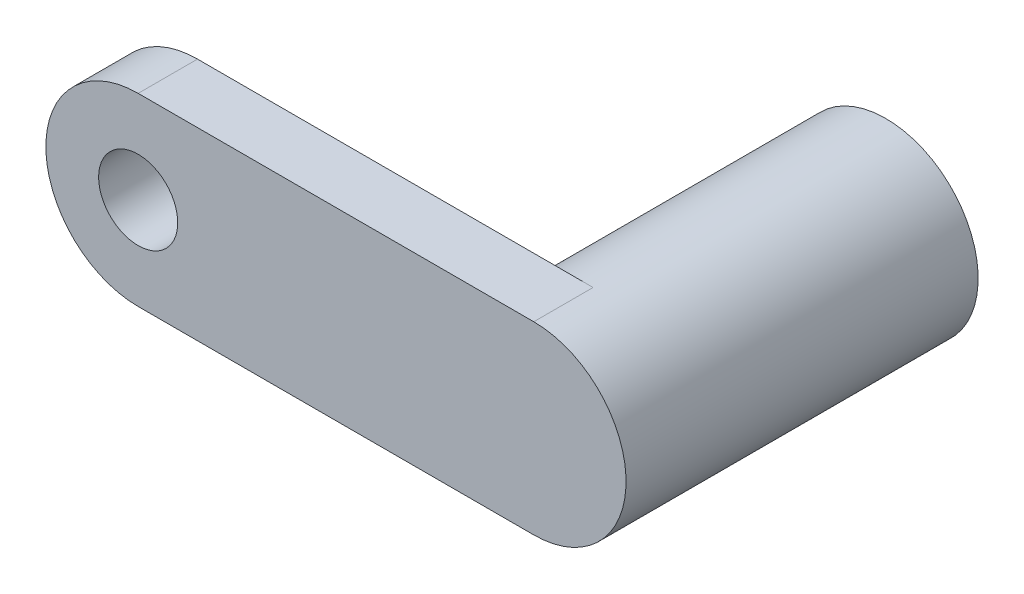
ISO-10303-21;
HEADER;
FILE_DESCRIPTION(('STEP AP214'),'2;1');
FILE_NAME('part.step','',(''),(''),'','','');
FILE_SCHEMA(('AUTOMOTIVE_DESIGN { 1 0 10303 214 1 1 1 1 }'));
ENDSEC;
DATA;
#1=APPLICATION_CONTEXT('core data for automotive mechanical design processes');
#2=APPLICATION_PROTOCOL_DEFINITION('international standard','automotive_design',2000,#1);
#3=PRODUCT_CONTEXT('',#1,'mechanical');
#4=PRODUCT('Part','Part','',(#3));
#5=PRODUCT_RELATED_PRODUCT_CATEGORY('part','',(#4));
#6=PRODUCT_DEFINITION_FORMATION('','',#4);
#7=PRODUCT_DEFINITION_CONTEXT('part definition',#1,'design');
#8=PRODUCT_DEFINITION('design','',#6,#7);
#9=PRODUCT_DEFINITION_SHAPE('','',#8);
#10=(LENGTH_UNIT() NAMED_UNIT(*) SI_UNIT(.MILLI.,.METRE.));
#11=(NAMED_UNIT(*) PLANE_ANGLE_UNIT() SI_UNIT($,.RADIAN.));
#12=(NAMED_UNIT(*) SI_UNIT($,.STERADIAN.) SOLID_ANGLE_UNIT());
#13=UNCERTAINTY_MEASURE_WITH_UNIT(LENGTH_MEASURE(1.E-05),#10,'distance_accuracy_value','');
#14=(GEOMETRIC_REPRESENTATION_CONTEXT(3) GLOBAL_UNCERTAINTY_ASSIGNED_CONTEXT((#13)) GLOBAL_UNIT_ASSIGNED_CONTEXT((#10,
#11,#12)) REPRESENTATION_CONTEXT('',''));
#15=CARTESIAN_POINT('',(0.,0.,0.));
#16=DIRECTION('',(0.,0.,1.));
#17=DIRECTION('',(1.,0.,0.));
#18=AXIS2_PLACEMENT_3D('',#15,#16,#17);
#19=CARTESIAN_POINT('',(0.,0.,4.5));
#20=DIRECTION('',(0.,0.,-1.));
#21=DIRECTION('',(-1.,0.,0.));
#22=AXIS2_PLACEMENT_3D('',#19,#20,#21);
#23=CYLINDRICAL_SURFACE('',#22,7.);
#24=CARTESIAN_POINT('',(0.,0.,0.));
#25=DIRECTION('',(0.,0.,-1.));
#26=DIRECTION('',(-1.,0.,0.));
#27=AXIS2_PLACEMENT_3D('',#24,#25,#26);
#28=CIRCLE('',#27,7.);
#29=CARTESIAN_POINT('',(0.,-7.,0.));
#30=VERTEX_POINT('',#29);
#31=CARTESIAN_POINT('',(0.,7.,0.));
#32=VERTEX_POINT('',#31);
#33=EDGE_CURVE('E82',#30,#32,#28,.T.);
#34=ORIENTED_EDGE('',*,*,#33,.F.);
#35=DIRECTION('',(0.,0.,-1.));
#36=VECTOR('',#35,1.);
#37=CARTESIAN_POINT('',(0.,-7.,4.5));
#38=LINE('',#37,#36);
#39=CARTESIAN_POINT('',(0.,-7.,4.5));
#40=VERTEX_POINT('',#39);
#41=EDGE_CURVE('E42',#40,#30,#38,.T.);
#42=ORIENTED_EDGE('',*,*,#41,.F.);
#43=CARTESIAN_POINT('',(0.,0.,4.5));
#44=DIRECTION('',(0.,0.,-1.));
#45=DIRECTION('',(-1.,0.,0.));
#46=AXIS2_PLACEMENT_3D('',#43,#44,#45);
#47=CIRCLE('',#46,7.);
#48=CARTESIAN_POINT('',(0.,7.,4.5));
#49=VERTEX_POINT('',#48);
#50=EDGE_CURVE('E98',#40,#49,#47,.T.);
#51=ORIENTED_EDGE('',*,*,#50,.T.);
#52=DIRECTION('',(0.,0.,-1.));
#53=VECTOR('',#52,1.);
#54=CARTESIAN_POINT('',(0.,7.,4.5));
#55=LINE('',#54,#53);
#56=EDGE_CURVE('E36',#49,#32,#55,.T.);
#57=ORIENTED_EDGE('',*,*,#56,.T.);
#58=EDGE_LOOP('',(#34,#42,#51,#57));
#59=FACE_BOUND('',#58,.T.);
#60=ADVANCED_FACE('F33',(#59),#23,.T.);
#61=CARTESIAN_POINT('',(30.,-7.,4.5));
#62=DIRECTION('',(0.,-1.,0.));
#63=DIRECTION('',(0.,0.,-1.));
#64=AXIS2_PLACEMENT_3D('',#61,#62,#63);
#65=PLANE('',#64);
#66=DIRECTION('',(-1.,0.,0.));
#67=VECTOR('',#66,1.);
#68=CARTESIAN_POINT('',(30.,-7.,0.));
#69=LINE('',#68,#67);
#70=CARTESIAN_POINT('',(30.,-7.,0.));
#71=VERTEX_POINT('',#70);
#72=EDGE_CURVE('E83',#71,#30,#69,.T.);
#73=ORIENTED_EDGE('',*,*,#72,.F.);
#74=DIRECTION('',(0.,0.,-1.));
#75=VECTOR('',#74,1.);
#76=CARTESIAN_POINT('',(30.,-7.,4.5));
#77=LINE('',#76,#75);
#78=CARTESIAN_POINT('',(30.,-7.,4.5));
#79=VERTEX_POINT('',#78);
#80=EDGE_CURVE('E91',#79,#71,#77,.T.);
#81=ORIENTED_EDGE('',*,*,#80,.F.);
#82=DIRECTION('',(-1.,0.,0.));
#83=VECTOR('',#82,1.);
#84=CARTESIAN_POINT('',(30.,-7.,4.5));
#85=LINE('',#84,#83);
#86=EDGE_CURVE('E105',#79,#40,#85,.T.);
#87=ORIENTED_EDGE('',*,*,#86,.T.);
#88=ORIENTED_EDGE('',*,*,#41,.T.);
#89=EDGE_LOOP('',(#73,#81,#87,#88));
#90=FACE_BOUND('',#89,.T.);
#91=ADVANCED_FACE('F97',(#90),#65,.T.);
#92=CARTESIAN_POINT('',(30.,0.,4.5));
#93=DIRECTION('',(0.,0.,-1.));
#94=DIRECTION('',(-1.,0.,0.));
#95=AXIS2_PLACEMENT_3D('',#92,#93,#94);
#96=CYLINDRICAL_SURFACE('',#95,7.);
#97=ORIENTED_EDGE('',*,*,#80,.T.);
#98=CARTESIAN_POINT('',(30.,0.,0.));
#99=DIRECTION('',(0.,0.,-1.));
#100=DIRECTION('',(-1.,0.,0.));
#101=AXIS2_PLACEMENT_3D('',#98,#99,#100);
#102=CIRCLE('',#101,7.);
#103=CARTESIAN_POINT('',(30.,7.,0.));
#104=VERTEX_POINT('',#103);
#105=EDGE_CURVE('E11',#71,#104,#102,.T.);
#106=ORIENTED_EDGE('',*,*,#105,.T.);
#107=DIRECTION('',(0.,0.,-1.));
#108=VECTOR('',#107,1.);
#109=CARTESIAN_POINT('',(30.,7.,4.5));
#110=LINE('',#109,#108);
#111=CARTESIAN_POINT('',(30.,7.,4.5));
#112=VERTEX_POINT('',#111);
#113=EDGE_CURVE('E85',#112,#104,#110,.T.);
#114=ORIENTED_EDGE('',*,*,#113,.F.);
#115=CARTESIAN_POINT('',(30.,0.,4.5));
#116=DIRECTION('',(0.,0.,-1.));
#117=DIRECTION('',(-1.,0.,0.));
#118=AXIS2_PLACEMENT_3D('',#115,#116,#117);
#119=CIRCLE('',#118,7.);
#120=EDGE_CURVE('E94',#112,#79,#119,.T.);
#121=ORIENTED_EDGE('',*,*,#120,.T.);
#122=EDGE_LOOP('',(#97,#106,#114,#121));
#123=FACE_BOUND('',#122,.T.);
#124=CARTESIAN_POINT('',(30.,0.,-22.2));
#125=DIRECTION('',(0.,0.,-1.));
#126=DIRECTION('',(-1.,0.,0.));
#127=AXIS2_PLACEMENT_3D('',#124,#125,#126);
#128=CIRCLE('',#127,7.);
#129=CARTESIAN_POINT('',(23.,0.,-22.2));
#130=VERTEX_POINT('',#129);
#131=EDGE_CURVE('E104',#130,#130,#128,.T.);
#132=ORIENTED_EDGE('',*,*,#131,.F.);
#133=EDGE_LOOP('',(#132));
#134=FACE_BOUND('',#133,.T.);
#135=ADVANCED_FACE('F92',(#123,#134),#96,.T.);
#136=CARTESIAN_POINT('',(0.,7.,4.5));
#137=DIRECTION('',(0.,1.,0.));
#138=DIRECTION('',(-1.,0.,0.));
#139=AXIS2_PLACEMENT_3D('',#136,#137,#138);
#140=PLANE('',#139);
#141=DIRECTION('',(1.,0.,0.));
#142=VECTOR('',#141,1.);
#143=CARTESIAN_POINT('',(0.,7.,0.));
#144=LINE('',#143,#142);
#145=EDGE_CURVE('E79',#32,#104,#144,.T.);
#146=ORIENTED_EDGE('',*,*,#145,.F.);
#147=ORIENTED_EDGE('',*,*,#56,.F.);
#148=DIRECTION('',(1.,0.,0.));
#149=VECTOR('',#148,1.);
#150=CARTESIAN_POINT('',(0.,7.,4.5));
#151=LINE('',#150,#149);
#152=EDGE_CURVE('E87',#49,#112,#151,.T.);
#153=ORIENTED_EDGE('',*,*,#152,.T.);
#154=ORIENTED_EDGE('',*,*,#113,.T.);
#155=EDGE_LOOP('',(#146,#147,#153,#154));
#156=FACE_BOUND('',#155,.T.);
#157=ADVANCED_FACE('F86',(#156),#140,.T.);
#158=CARTESIAN_POINT('',(0.,0.,4.5));
#159=DIRECTION('',(0.,0.,-1.));
#160=DIRECTION('',(-1.,0.,0.));
#161=AXIS2_PLACEMENT_3D('',#158,#159,#160);
#162=PLANE('',#161);
#163=CARTESIAN_POINT('',(0.,0.,4.5));
#164=DIRECTION('',(0.,0.,-1.));
#165=DIRECTION('',(-1.,0.,0.));
#166=AXIS2_PLACEMENT_3D('',#163,#164,#165);
#167=CIRCLE('',#166,2.99999999999999);
#168=CARTESIAN_POINT('',(-2.99999999999999,0.,4.5));
#169=VERTEX_POINT('',#168);
#170=EDGE_CURVE('E117',#169,#169,#167,.T.);
#171=ORIENTED_EDGE('',*,*,#170,.T.);
#172=EDGE_LOOP('',(#171));
#173=FACE_BOUND('',#172,.T.);
#174=ORIENTED_EDGE('',*,*,#50,.F.);
#175=ORIENTED_EDGE('',*,*,#86,.F.);
#176=ORIENTED_EDGE('',*,*,#120,.F.);
#177=ORIENTED_EDGE('',*,*,#152,.F.);
#178=EDGE_LOOP('',(#174,#175,#176,#177));
#179=FACE_BOUND('',#178,.T.);
#180=ADVANCED_FACE('F128',(#173,#179),#162,.F.);
#181=CARTESIAN_POINT('',(0.,0.,0.));
#182=DIRECTION('',(0.,0.,-1.));
#183=DIRECTION('',(-1.,0.,0.));
#184=AXIS2_PLACEMENT_3D('',#181,#182,#183);
#185=PLANE('',#184);
#186=CARTESIAN_POINT('',(0.,0.,0.));
#187=DIRECTION('',(0.,0.,-1.));
#188=DIRECTION('',(-1.,0.,0.));
#189=AXIS2_PLACEMENT_3D('',#186,#187,#188);
#190=CIRCLE('',#189,2.99999999999999);
#191=CARTESIAN_POINT('',(-2.99999999999999,0.,0.));
#192=VERTEX_POINT('',#191);
#193=EDGE_CURVE('E120',#192,#192,#190,.T.);
#194=ORIENTED_EDGE('',*,*,#193,.F.);
#195=EDGE_LOOP('',(#194));
#196=FACE_BOUND('',#195,.T.);
#197=ORIENTED_EDGE('',*,*,#105,.F.);
#198=ORIENTED_EDGE('',*,*,#72,.T.);
#199=ORIENTED_EDGE('',*,*,#33,.T.);
#200=ORIENTED_EDGE('',*,*,#145,.T.);
#201=EDGE_LOOP('',(#197,#198,#199,#200));
#202=FACE_BOUND('',#201,.T.);
#203=ADVANCED_FACE('F81',(#196,#202),#185,.T.);
#204=CARTESIAN_POINT('',(30.,0.,-22.2));
#205=DIRECTION('',(0.,0.,-1.));
#206=DIRECTION('',(-1.,0.,0.));
#207=AXIS2_PLACEMENT_3D('',#204,#205,#206);
#208=PLANE('',#207);
#209=CARTESIAN_POINT('',(30.,0.,-22.2));
#210=DIRECTION('',(0.,0.,-1.));
#211=DIRECTION('',(-1.,0.,0.));
#212=AXIS2_PLACEMENT_3D('',#209,#210,#211);
#213=CIRCLE('',#212,2.09999999999999);
#214=CARTESIAN_POINT('',(27.9,0.,-22.2));
#215=VERTEX_POINT('',#214);
#216=EDGE_CURVE('E114',#215,#215,#213,.T.);
#217=ORIENTED_EDGE('',*,*,#216,.F.);
#218=EDGE_LOOP('',(#217));
#219=FACE_BOUND('',#218,.T.);
#220=ORIENTED_EDGE('',*,*,#131,.T.);
#221=EDGE_LOOP('',(#220));
#222=FACE_BOUND('',#221,.T.);
#223=ADVANCED_FACE('F127',(#219,#222),#208,.T.);
#224=CARTESIAN_POINT('',(30.,0.,-12.2));
#225=DIRECTION('',(0.,0.,1.));
#226=DIRECTION('',(1.,0.,0.));
#227=AXIS2_PLACEMENT_3D('',#224,#225,#226);
#228=PLANE('',#227);
#229=CARTESIAN_POINT('',(30.,0.,-12.2));
#230=DIRECTION('',(0.,0.,-1.));
#231=DIRECTION('',(-1.,0.,0.));
#232=AXIS2_PLACEMENT_3D('',#229,#230,#231);
#233=CIRCLE('',#232,2.09999999999999);
#234=CARTESIAN_POINT('',(27.9,0.,-12.2));
#235=VERTEX_POINT('',#234);
#236=EDGE_CURVE('E111',#235,#235,#233,.T.);
#237=ORIENTED_EDGE('',*,*,#236,.T.);
#238=EDGE_LOOP('',(#237));
#239=FACE_BOUND('',#238,.T.);
#240=ADVANCED_FACE('F134',(#239),#228,.F.);
#241=CARTESIAN_POINT('',(30.,0.,-22.2));
#242=DIRECTION('',(0.,0.,-1.));
#243=DIRECTION('',(-1.,0.,0.));
#244=AXIS2_PLACEMENT_3D('',#241,#242,#243);
#245=CYLINDRICAL_SURFACE('',#244,2.09999999999999);
#246=ORIENTED_EDGE('',*,*,#236,.F.);
#247=EDGE_LOOP('',(#246));
#248=FACE_BOUND('',#247,.T.);
#249=ORIENTED_EDGE('',*,*,#216,.T.);
#250=EDGE_LOOP('',(#249));
#251=FACE_BOUND('',#250,.T.);
#252=ADVANCED_FACE('F164',(#248,#251),#245,.F.);
#253=CARTESIAN_POINT('',(0.,0.,0.));
#254=DIRECTION('',(0.,0.,-1.));
#255=DIRECTION('',(-1.,0.,0.));
#256=AXIS2_PLACEMENT_3D('',#253,#254,#255);
#257=CYLINDRICAL_SURFACE('',#256,2.99999999999999);
#258=ORIENTED_EDGE('',*,*,#170,.F.);
#259=EDGE_LOOP('',(#258));
#260=FACE_BOUND('',#259,.T.);
#261=ORIENTED_EDGE('',*,*,#193,.T.);
#262=EDGE_LOOP('',(#261));
#263=FACE_BOUND('',#262,.T.);
#264=ADVANCED_FACE('F124',(#260,#263),#257,.F.);
#265=CLOSED_SHELL('',(#60,#91,#135,#157,#180,#203,#223,#240,#252,#264));
#266=MANIFOLD_SOLID_BREP('B2',#265);
#267=ADVANCED_BREP_SHAPE_REPRESENTATION('',(#18,#266),#14);
#268=SHAPE_DEFINITION_REPRESENTATION(#9,#267);
ENDSEC;
END-ISO-10303-21;
